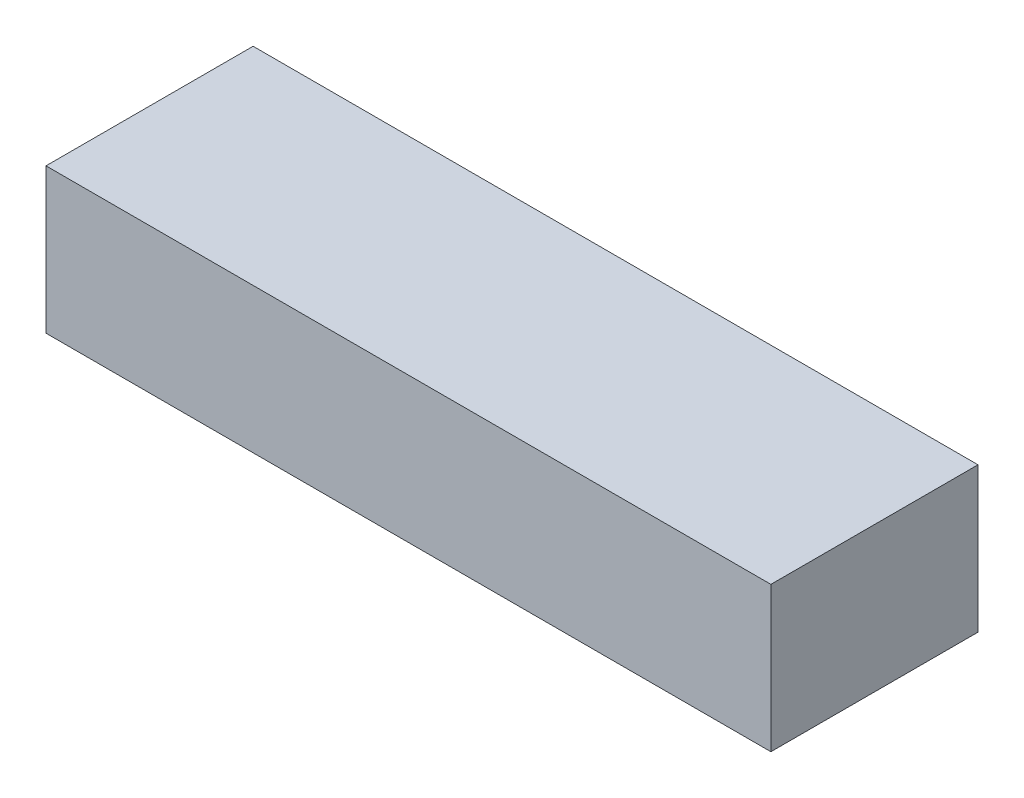
ISO-10303-21;
HEADER;
FILE_DESCRIPTION(('STEP AP214'),'2;1');
FILE_NAME('part.step','',(''),(''),'','','');
FILE_SCHEMA(('AUTOMOTIVE_DESIGN { 1 0 10303 214 1 1 1 1 }'));
ENDSEC;
DATA;
#1=APPLICATION_CONTEXT('core data for automotive mechanical design processes');
#2=APPLICATION_PROTOCOL_DEFINITION('international standard','automotive_design',2000,#1);
#3=PRODUCT_CONTEXT('',#1,'mechanical');
#4=PRODUCT('Part','Part','',(#3));
#5=PRODUCT_RELATED_PRODUCT_CATEGORY('part','',(#4));
#6=PRODUCT_DEFINITION_FORMATION('','',#4);
#7=PRODUCT_DEFINITION_CONTEXT('part definition',#1,'design');
#8=PRODUCT_DEFINITION('design','',#6,#7);
#9=PRODUCT_DEFINITION_SHAPE('','',#8);
#10=(LENGTH_UNIT() NAMED_UNIT(*) SI_UNIT(.MILLI.,.METRE.));
#11=(NAMED_UNIT(*) PLANE_ANGLE_UNIT() SI_UNIT($,.RADIAN.));
#12=(NAMED_UNIT(*) SI_UNIT($,.STERADIAN.) SOLID_ANGLE_UNIT());
#13=UNCERTAINTY_MEASURE_WITH_UNIT(LENGTH_MEASURE(1.E-05),#10,'distance_accuracy_value','');
#14=(GEOMETRIC_REPRESENTATION_CONTEXT(3) GLOBAL_UNCERTAINTY_ASSIGNED_CONTEXT((#13)) GLOBAL_UNIT_ASSIGNED_CONTEXT((#10,
#11,#12)) REPRESENTATION_CONTEXT('',''));
#15=CARTESIAN_POINT('',(0.,0.,0.));
#16=DIRECTION('',(0.,0.,1.));
#17=DIRECTION('',(1.,0.,0.));
#18=AXIS2_PLACEMENT_3D('',#15,#16,#17);
#19=CARTESIAN_POINT('',(-8.75,3.5,-2.5));
#20=DIRECTION('',(1.,0.,0.));
#21=DIRECTION('',(0.,0.,-1.));
#22=AXIS2_PLACEMENT_3D('',#19,#20,#21);
#23=PLANE('',#22);
#24=DIRECTION('',(0.,0.,1.));
#25=VECTOR('',#24,1.);
#26=CARTESIAN_POINT('',(-8.75,0.,-2.5));
#27=LINE('',#26,#25);
#28=CARTESIAN_POINT('',(-8.75,0.,-2.5));
#29=VERTEX_POINT('',#28);
#30=CARTESIAN_POINT('',(-8.75,0.,2.5));
#31=VERTEX_POINT('',#30);
#32=EDGE_CURVE('E100',#29,#31,#27,.T.);
#33=ORIENTED_EDGE('',*,*,#32,.T.);
#34=DIRECTION('',(0.,-1.,0.));
#35=VECTOR('',#34,1.);
#36=CARTESIAN_POINT('',(-8.75,3.5,2.5));
#37=LINE('',#36,#35);
#38=CARTESIAN_POINT('',(-8.75,3.5,2.5));
#39=VERTEX_POINT('',#38);
#40=EDGE_CURVE('E11',#39,#31,#37,.T.);
#41=ORIENTED_EDGE('',*,*,#40,.F.);
#42=DIRECTION('',(0.,0.,1.));
#43=VECTOR('',#42,1.);
#44=CARTESIAN_POINT('',(-8.75,3.5,-2.5));
#45=LINE('',#44,#43);
#46=CARTESIAN_POINT('',(-8.75,3.5,-2.5));
#47=VERTEX_POINT('',#46);
#48=EDGE_CURVE('E88',#47,#39,#45,.T.);
#49=ORIENTED_EDGE('',*,*,#48,.F.);
#50=DIRECTION('',(0.,-1.,0.));
#51=VECTOR('',#50,1.);
#52=CARTESIAN_POINT('',(-8.75,3.5,-2.5));
#53=LINE('',#52,#51);
#54=EDGE_CURVE('E96',#47,#29,#53,.T.);
#55=ORIENTED_EDGE('',*,*,#54,.T.);
#56=EDGE_LOOP('',(#33,#41,#49,#55));
#57=FACE_BOUND('',#56,.T.);
#58=ADVANCED_FACE('F37',(#57),#23,.F.);
#59=CARTESIAN_POINT('',(-8.75,3.5,2.5));
#60=DIRECTION('',(0.,0.,-1.));
#61=DIRECTION('',(-1.,0.,0.));
#62=AXIS2_PLACEMENT_3D('',#59,#60,#61);
#63=PLANE('',#62);
#64=DIRECTION('',(1.,0.,0.));
#65=VECTOR('',#64,1.);
#66=CARTESIAN_POINT('',(-8.75,0.,2.5));
#67=LINE('',#66,#65);
#68=CARTESIAN_POINT('',(8.75,0.,2.5));
#69=VERTEX_POINT('',#68);
#70=EDGE_CURVE('E92',#31,#69,#67,.T.);
#71=ORIENTED_EDGE('',*,*,#70,.T.);
#72=DIRECTION('',(0.,-1.,0.));
#73=VECTOR('',#72,1.);
#74=CARTESIAN_POINT('',(8.75,3.5,2.5));
#75=LINE('',#74,#73);
#76=CARTESIAN_POINT('',(8.75,3.5,2.5));
#77=VERTEX_POINT('',#76);
#78=EDGE_CURVE('E45',#77,#69,#75,.T.);
#79=ORIENTED_EDGE('',*,*,#78,.F.);
#80=DIRECTION('',(1.,0.,0.));
#81=VECTOR('',#80,1.);
#82=CARTESIAN_POINT('',(-8.75,3.5,2.5));
#83=LINE('',#82,#81);
#84=EDGE_CURVE('E83',#39,#77,#83,.T.);
#85=ORIENTED_EDGE('',*,*,#84,.F.);
#86=ORIENTED_EDGE('',*,*,#40,.T.);
#87=EDGE_LOOP('',(#71,#79,#85,#86));
#88=FACE_BOUND('',#87,.T.);
#89=ADVANCED_FACE('F91',(#88),#63,.F.);
#90=CARTESIAN_POINT('',(8.75,3.5,-2.5));
#91=DIRECTION('',(-1.,0.,0.));
#92=DIRECTION('',(0.,0.,1.));
#93=AXIS2_PLACEMENT_3D('',#90,#91,#92);
#94=PLANE('',#93);
#95=DIRECTION('',(0.,0.,-1.));
#96=VECTOR('',#95,1.);
#97=CARTESIAN_POINT('',(8.75,0.,-2.5));
#98=LINE('',#97,#96);
#99=CARTESIAN_POINT('',(8.75,0.,-2.5));
#100=VERTEX_POINT('',#99);
#101=EDGE_CURVE('E70',#69,#100,#98,.T.);
#102=ORIENTED_EDGE('',*,*,#101,.T.);
#103=DIRECTION('',(0.,-1.,0.));
#104=VECTOR('',#103,1.);
#105=CARTESIAN_POINT('',(8.75,3.5,-2.5));
#106=LINE('',#105,#104);
#107=CARTESIAN_POINT('',(8.75,3.5,-2.5));
#108=VERTEX_POINT('',#107);
#109=EDGE_CURVE('E93',#108,#100,#106,.T.);
#110=ORIENTED_EDGE('',*,*,#109,.F.);
#111=DIRECTION('',(0.,0.,-1.));
#112=VECTOR('',#111,1.);
#113=CARTESIAN_POINT('',(8.75,3.5,-2.5));
#114=LINE('',#113,#112);
#115=EDGE_CURVE('E86',#77,#108,#114,.T.);
#116=ORIENTED_EDGE('',*,*,#115,.F.);
#117=ORIENTED_EDGE('',*,*,#78,.T.);
#118=EDGE_LOOP('',(#102,#110,#116,#117));
#119=FACE_BOUND('',#118,.T.);
#120=ADVANCED_FACE('F94',(#119),#94,.F.);
#121=CARTESIAN_POINT('',(-8.75,3.5,-2.5));
#122=DIRECTION('',(0.,0.,1.));
#123=DIRECTION('',(1.,0.,0.));
#124=AXIS2_PLACEMENT_3D('',#121,#122,#123);
#125=PLANE('',#124);
#126=DIRECTION('',(-1.,0.,0.));
#127=VECTOR('',#126,1.);
#128=CARTESIAN_POINT('',(-8.75,0.,-2.5));
#129=LINE('',#128,#127);
#130=EDGE_CURVE('E76',#100,#29,#129,.T.);
#131=ORIENTED_EDGE('',*,*,#130,.T.);
#132=ORIENTED_EDGE('',*,*,#54,.F.);
#133=DIRECTION('',(-1.,0.,0.));
#134=VECTOR('',#133,1.);
#135=CARTESIAN_POINT('',(-8.75,3.5,-2.5));
#136=LINE('',#135,#134);
#137=EDGE_CURVE('E53',#108,#47,#136,.T.);
#138=ORIENTED_EDGE('',*,*,#137,.F.);
#139=ORIENTED_EDGE('',*,*,#109,.T.);
#140=EDGE_LOOP('',(#131,#132,#138,#139));
#141=FACE_BOUND('',#140,.T.);
#142=ADVANCED_FACE('F107',(#141),#125,.F.);
#143=CARTESIAN_POINT('',(0.,3.5,0.));
#144=DIRECTION('',(0.,1.,0.));
#145=DIRECTION('',(0.,0.,1.));
#146=AXIS2_PLACEMENT_3D('',#143,#144,#145);
#147=PLANE('',#146);
#148=ORIENTED_EDGE('',*,*,#48,.T.);
#149=ORIENTED_EDGE('',*,*,#84,.T.);
#150=ORIENTED_EDGE('',*,*,#115,.T.);
#151=ORIENTED_EDGE('',*,*,#137,.T.);
#152=EDGE_LOOP('',(#148,#149,#150,#151));
#153=FACE_BOUND('',#152,.T.);
#154=ADVANCED_FACE('F84',(#153),#147,.T.);
#155=CARTESIAN_POINT('',(0.,0.,0.));
#156=DIRECTION('',(0.,1.,0.));
#157=DIRECTION('',(0.,0.,1.));
#158=AXIS2_PLACEMENT_3D('',#155,#156,#157);
#159=PLANE('',#158);
#160=ORIENTED_EDGE('',*,*,#32,.F.);
#161=ORIENTED_EDGE('',*,*,#130,.F.);
#162=ORIENTED_EDGE('',*,*,#101,.F.);
#163=ORIENTED_EDGE('',*,*,#70,.F.);
#164=EDGE_LOOP('',(#160,#161,#162,#163));
#165=FACE_BOUND('',#164,.T.);
#166=ADVANCED_FACE('F110',(#165),#159,.F.);
#167=CLOSED_SHELL('',(#58,#89,#120,#142,#154,#166));
#168=MANIFOLD_SOLID_BREP('B2',#167);
#169=ADVANCED_BREP_SHAPE_REPRESENTATION('',(#18,#168),#14);
#170=SHAPE_DEFINITION_REPRESENTATION(#9,#169);
ENDSEC;
END-ISO-10303-21;
